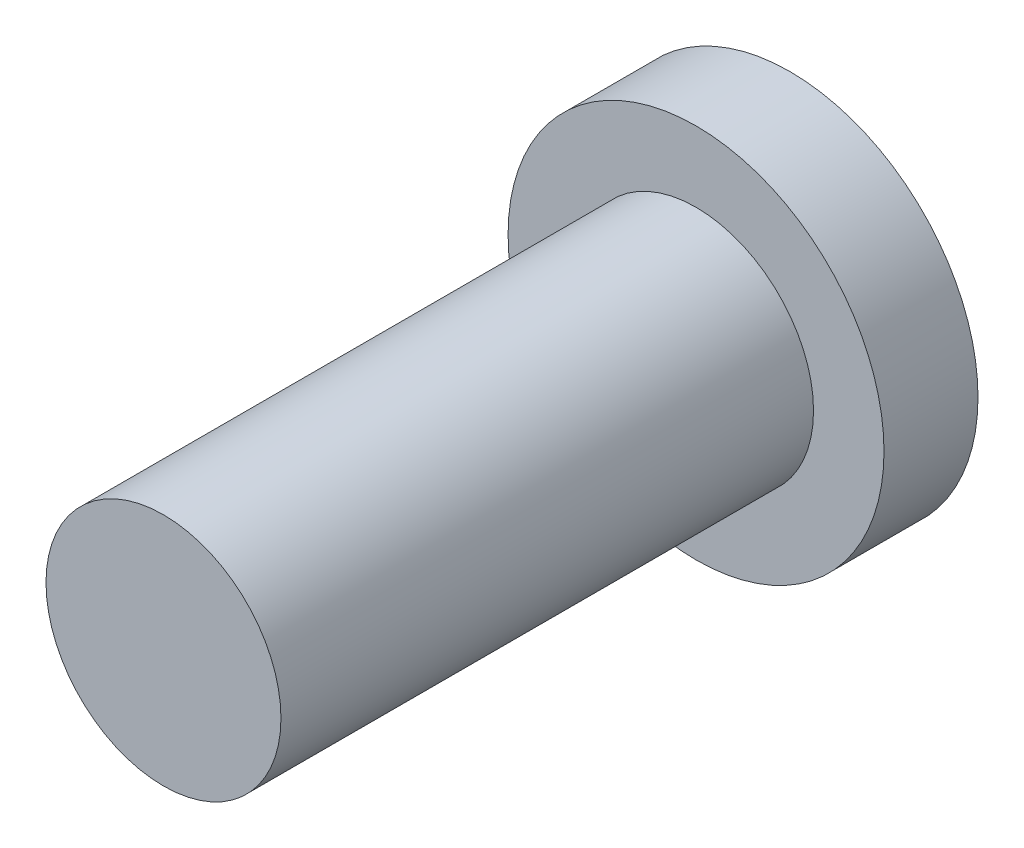
ISO-10303-21;
HEADER;
FILE_DESCRIPTION(('STEP AP214'),'2;1');
FILE_NAME('part.step','',(''),(''),'','','');
FILE_SCHEMA(('AUTOMOTIVE_DESIGN { 1 0 10303 214 1 1 1 1 }'));
ENDSEC;
DATA;
#1=APPLICATION_CONTEXT('core data for automotive mechanical design processes');
#2=APPLICATION_PROTOCOL_DEFINITION('international standard','automotive_design',2000,#1);
#3=PRODUCT_CONTEXT('',#1,'mechanical');
#4=PRODUCT('Part','Part','',(#3));
#5=PRODUCT_RELATED_PRODUCT_CATEGORY('part','',(#4));
#6=PRODUCT_DEFINITION_FORMATION('','',#4);
#7=PRODUCT_DEFINITION_CONTEXT('part definition',#1,'design');
#8=PRODUCT_DEFINITION('design','',#6,#7);
#9=PRODUCT_DEFINITION_SHAPE('','',#8);
#10=(LENGTH_UNIT() NAMED_UNIT(*) SI_UNIT(.MILLI.,.METRE.));
#11=(NAMED_UNIT(*) PLANE_ANGLE_UNIT() SI_UNIT($,.RADIAN.));
#12=(NAMED_UNIT(*) SI_UNIT($,.STERADIAN.) SOLID_ANGLE_UNIT());
#13=UNCERTAINTY_MEASURE_WITH_UNIT(LENGTH_MEASURE(1.E-05),#10,'distance_accuracy_value','');
#14=(GEOMETRIC_REPRESENTATION_CONTEXT(3) GLOBAL_UNCERTAINTY_ASSIGNED_CONTEXT((#13)) GLOBAL_UNIT_ASSIGNED_CONTEXT((#10,
#11,#12)) REPRESENTATION_CONTEXT('',''));
#15=CARTESIAN_POINT('',(0.,0.,0.));
#16=DIRECTION('',(0.,0.,1.));
#17=DIRECTION('',(1.,0.,0.));
#18=AXIS2_PLACEMENT_3D('',#15,#16,#17);
#19=CARTESIAN_POINT('',(0.,0.,3.));
#20=DIRECTION('',(0.,0.,1.));
#21=DIRECTION('',(1.,0.,0.));
#22=AXIS2_PLACEMENT_3D('',#19,#20,#21);
#23=PLANE('',#22);
#24=CARTESIAN_POINT('',(0.,0.,3.));
#25=DIRECTION('',(0.,0.,1.));
#26=DIRECTION('',(1.,0.,0.));
#27=AXIS2_PLACEMENT_3D('',#24,#25,#26);
#28=CIRCLE('',#27,6.);
#29=CARTESIAN_POINT('',(6.,0.,3.));
#30=VERTEX_POINT('',#29);
#31=EDGE_CURVE('E10',#30,#30,#28,.T.);
#32=ORIENTED_EDGE('',*,*,#31,.T.);
#33=EDGE_LOOP('',(#32));
#34=FACE_BOUND('',#33,.T.);
#35=CARTESIAN_POINT('',(0.,0.,3.));
#36=DIRECTION('',(0.,0.,1.));
#37=DIRECTION('',(1.,0.,0.));
#38=AXIS2_PLACEMENT_3D('',#35,#36,#37);
#39=CIRCLE('',#38,3.75);
#40=CARTESIAN_POINT('',(3.75,0.,3.));
#41=VERTEX_POINT('',#40);
#42=EDGE_CURVE('E50',#41,#41,#39,.T.);
#43=ORIENTED_EDGE('',*,*,#42,.F.);
#44=EDGE_LOOP('',(#43));
#45=FACE_BOUND('',#44,.T.);
#46=ADVANCED_FACE('F37',(#34,#45),#23,.T.);
#47=CARTESIAN_POINT('',(0.,0.,0.));
#48=DIRECTION('',(0.,0.,1.));
#49=DIRECTION('',(1.,0.,0.));
#50=AXIS2_PLACEMENT_3D('',#47,#48,#49);
#51=PLANE('',#50);
#52=CARTESIAN_POINT('',(0.,0.,0.));
#53=DIRECTION('',(0.,0.,1.));
#54=DIRECTION('',(1.,0.,0.));
#55=AXIS2_PLACEMENT_3D('',#52,#53,#54);
#56=CIRCLE('',#55,6.);
#57=CARTESIAN_POINT('',(6.,0.,0.));
#58=VERTEX_POINT('',#57);
#59=EDGE_CURVE('E41',#58,#58,#56,.T.);
#60=ORIENTED_EDGE('',*,*,#59,.F.);
#61=EDGE_LOOP('',(#60));
#62=FACE_BOUND('',#61,.T.);
#63=ADVANCED_FACE('F71',(#62),#51,.F.);
#64=CARTESIAN_POINT('',(0.,0.,3.));
#65=DIRECTION('',(0.,0.,-1.));
#66=DIRECTION('',(-1.,0.,0.));
#67=AXIS2_PLACEMENT_3D('',#64,#65,#66);
#68=CYLINDRICAL_SURFACE('',#67,6.);
#69=ORIENTED_EDGE('',*,*,#31,.F.);
#70=EDGE_LOOP('',(#69));
#71=FACE_BOUND('',#70,.T.);
#72=ORIENTED_EDGE('',*,*,#59,.T.);
#73=EDGE_LOOP('',(#72));
#74=FACE_BOUND('',#73,.T.);
#75=ADVANCED_FACE('F39',(#71,#74),#68,.T.);
#76=CARTESIAN_POINT('',(0.,0.,20.));
#77=DIRECTION('',(0.,0.,-1.));
#78=DIRECTION('',(-1.,0.,0.));
#79=AXIS2_PLACEMENT_3D('',#76,#77,#78);
#80=CYLINDRICAL_SURFACE('',#79,3.75);
#81=ORIENTED_EDGE('',*,*,#42,.T.);
#82=EDGE_LOOP('',(#81));
#83=FACE_BOUND('',#82,.T.);
#84=CARTESIAN_POINT('',(0.,0.,20.));
#85=DIRECTION('',(0.,0.,1.));
#86=DIRECTION('',(1.,0.,0.));
#87=AXIS2_PLACEMENT_3D('',#84,#85,#86);
#88=CIRCLE('',#87,3.75);
#89=CARTESIAN_POINT('',(3.75,0.,20.));
#90=VERTEX_POINT('',#89);
#91=EDGE_CURVE('E55',#90,#90,#88,.T.);
#92=ORIENTED_EDGE('',*,*,#91,.F.);
#93=EDGE_LOOP('',(#92));
#94=FACE_BOUND('',#93,.T.);
#95=ADVANCED_FACE('F62',(#83,#94),#80,.T.);
#96=CARTESIAN_POINT('',(0.,0.,20.));
#97=DIRECTION('',(0.,0.,1.));
#98=DIRECTION('',(1.,0.,0.));
#99=AXIS2_PLACEMENT_3D('',#96,#97,#98);
#100=PLANE('',#99);
#101=ORIENTED_EDGE('',*,*,#91,.T.);
#102=EDGE_LOOP('',(#101));
#103=FACE_BOUND('',#102,.T.);
#104=ADVANCED_FACE('F60',(#103),#100,.T.);
#105=CLOSED_SHELL('',(#46,#63,#75,#95,#104));
#106=MANIFOLD_SOLID_BREP('B2',#105);
#107=ADVANCED_BREP_SHAPE_REPRESENTATION('',(#18,#106),#14);
#108=SHAPE_DEFINITION_REPRESENTATION(#9,#107);
ENDSEC;
END-ISO-10303-21;
